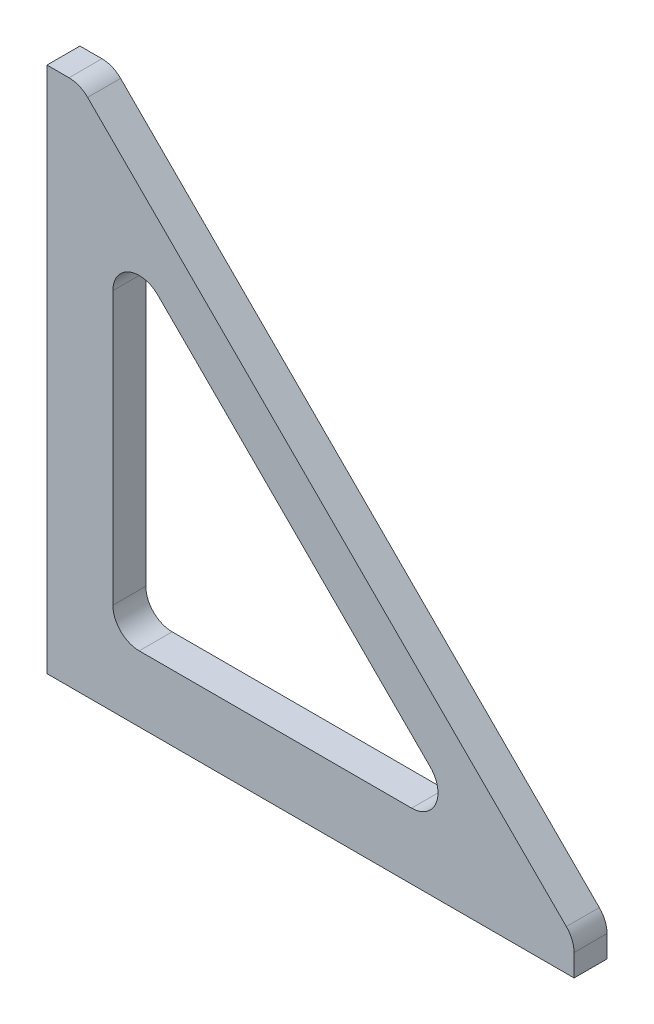
ISO-10303-21;
HEADER;
FILE_DESCRIPTION(('STEP AP214'),'2;1');
FILE_NAME('part.step','',(''),(''),'','','');
FILE_SCHEMA(('AUTOMOTIVE_DESIGN { 1 0 10303 214 1 1 1 1 }'));
ENDSEC;
DATA;
#1=APPLICATION_CONTEXT('core data for automotive mechanical design processes');
#2=APPLICATION_PROTOCOL_DEFINITION('international standard','automotive_design',2000,#1);
#3=PRODUCT_CONTEXT('',#1,'mechanical');
#4=PRODUCT('Part','Part','',(#3));
#5=PRODUCT_RELATED_PRODUCT_CATEGORY('part','',(#4));
#6=PRODUCT_DEFINITION_FORMATION('','',#4);
#7=PRODUCT_DEFINITION_CONTEXT('part definition',#1,'design');
#8=PRODUCT_DEFINITION('design','',#6,#7);
#9=PRODUCT_DEFINITION_SHAPE('','',#8);
#10=(LENGTH_UNIT() NAMED_UNIT(*) SI_UNIT(.MILLI.,.METRE.));
#11=(NAMED_UNIT(*) PLANE_ANGLE_UNIT() SI_UNIT($,.RADIAN.));
#12=(NAMED_UNIT(*) SI_UNIT($,.STERADIAN.) SOLID_ANGLE_UNIT());
#13=UNCERTAINTY_MEASURE_WITH_UNIT(LENGTH_MEASURE(1.E-05),#10,'distance_accuracy_value','');
#14=(GEOMETRIC_REPRESENTATION_CONTEXT(3) GLOBAL_UNCERTAINTY_ASSIGNED_CONTEXT((#13)) GLOBAL_UNIT_ASSIGNED_CONTEXT((#10,
#11,#12)) REPRESENTATION_CONTEXT('',''));
#15=CARTESIAN_POINT('',(0.,0.,0.));
#16=DIRECTION('',(0.,0.,1.));
#17=DIRECTION('',(1.,0.,0.));
#18=AXIS2_PLACEMENT_3D('',#15,#16,#17);
#19=CARTESIAN_POINT('',(50.8,3.175,3.175));
#20=DIRECTION('',(1.,0.,0.));
#21=DIRECTION('',(0.,0.,-1.));
#22=AXIS2_PLACEMENT_3D('',#19,#20,#21);
#23=PLANE('',#22);
#24=DIRECTION('',(0.,-1.,0.));
#25=VECTOR('',#24,1.);
#26=CARTESIAN_POINT('',(50.8,3.175,0.));
#27=LINE('',#26,#25);
#28=CARTESIAN_POINT('',(50.8,2.12289755157234,0.));
#29=VERTEX_POINT('',#28);
#30=CARTESIAN_POINT('',(50.8,0.,0.));
#31=VERTEX_POINT('',#30);
#32=EDGE_CURVE('E305',#29,#31,#27,.T.);
#33=ORIENTED_EDGE('',*,*,#32,.F.);
#34=DIRECTION('',(0.,0.,-1.));
#35=VECTOR('',#34,1.);
#36=CARTESIAN_POINT('',(50.8,2.12289755157234,3.175));
#37=LINE('',#36,#35);
#38=CARTESIAN_POINT('',(50.8,2.12289755157234,3.175));
#39=VERTEX_POINT('',#38);
#40=EDGE_CURVE('E152',#29,#39,#37,.F.);
#41=ORIENTED_EDGE('',*,*,#40,.T.);
#42=DIRECTION('',(0.,-1.,0.));
#43=VECTOR('',#42,1.);
#44=CARTESIAN_POINT('',(50.8,3.175,3.175));
#45=LINE('',#44,#43);
#46=CARTESIAN_POINT('',(50.8,0.,3.175));
#47=VERTEX_POINT('',#46);
#48=EDGE_CURVE('E146',#39,#47,#45,.T.);
#49=ORIENTED_EDGE('',*,*,#48,.T.);
#50=DIRECTION('',(0.,0.,-1.));
#51=VECTOR('',#50,1.);
#52=CARTESIAN_POINT('',(50.8,0.,3.175));
#53=LINE('',#52,#51);
#54=EDGE_CURVE('E149',#47,#31,#53,.T.);
#55=ORIENTED_EDGE('',*,*,#54,.T.);
#56=EDGE_LOOP('',(#33,#41,#49,#55));
#57=FACE_BOUND('',#56,.T.);
#58=ADVANCED_FACE('F50',(#57),#23,.T.);
#59=CARTESIAN_POINT('',(3.175,50.8,3.175));
#60=DIRECTION('',(0.707106781186548,0.707106781186548,0.));
#61=DIRECTION('',(-0.707106781186548,0.707106781186548,0.));
#62=AXIS2_PLACEMENT_3D('',#59,#60,#61);
#63=PLANE('',#62);
#64=DIRECTION('',(0.707106781186547,-0.707106781186547,0.));
#65=VECTOR('',#64,1.);
#66=CARTESIAN_POINT('',(3.175,50.8,0.));
#67=LINE('',#66,#65);
#68=CARTESIAN_POINT('',(3.91894877578617,50.0560512242138,0.));
#69=VERTEX_POINT('',#68);
#70=CARTESIAN_POINT('',(50.0560512242138,3.91894877578618,0.));
#71=VERTEX_POINT('',#70);
#72=EDGE_CURVE('E158',#69,#71,#67,.T.);
#73=ORIENTED_EDGE('',*,*,#72,.F.);
#74=DIRECTION('',(0.,0.,-1.));
#75=VECTOR('',#74,1.);
#76=CARTESIAN_POINT('',(3.91894877578617,50.0560512242138,3.175));
#77=LINE('',#76,#75);
#78=CARTESIAN_POINT('',(3.91894877578617,50.0560512242138,3.175));
#79=VERTEX_POINT('',#78);
#80=EDGE_CURVE('E226',#69,#79,#77,.F.);
#81=ORIENTED_EDGE('',*,*,#80,.T.);
#82=DIRECTION('',(0.707106781186547,-0.707106781186547,0.));
#83=VECTOR('',#82,1.);
#84=CARTESIAN_POINT('',(3.175,50.8,3.175));
#85=LINE('',#84,#83);
#86=CARTESIAN_POINT('',(50.0560512242138,3.91894877578618,3.175));
#87=VERTEX_POINT('',#86);
#88=EDGE_CURVE('E167',#79,#87,#85,.T.);
#89=ORIENTED_EDGE('',*,*,#88,.T.);
#90=DIRECTION('',(0.,0.,-1.));
#91=VECTOR('',#90,1.);
#92=CARTESIAN_POINT('',(50.0560512242138,3.91894877578618,3.175));
#93=LINE('',#92,#91);
#94=EDGE_CURVE('E222',#87,#71,#93,.T.);
#95=ORIENTED_EDGE('',*,*,#94,.T.);
#96=EDGE_LOOP('',(#73,#81,#89,#95));
#97=FACE_BOUND('',#96,.T.);
#98=ADVANCED_FACE('F331',(#97),#63,.T.);
#99=CARTESIAN_POINT('',(0.,50.8,3.175));
#100=DIRECTION('',(0.,1.,0.));
#101=DIRECTION('',(0.,0.,1.));
#102=AXIS2_PLACEMENT_3D('',#99,#100,#101);
#103=PLANE('',#102);
#104=DIRECTION('',(1.,0.,0.));
#105=VECTOR('',#104,1.);
#106=CARTESIAN_POINT('',(0.,50.8,3.175));
#107=LINE('',#106,#105);
#108=CARTESIAN_POINT('',(0.,50.8,3.175));
#109=VERTEX_POINT('',#108);
#110=CARTESIAN_POINT('',(2.12289755157234,50.8,3.175));
#111=VERTEX_POINT('',#110);
#112=EDGE_CURVE('E180',#109,#111,#107,.T.);
#113=ORIENTED_EDGE('',*,*,#112,.T.);
#114=DIRECTION('',(0.,0.,-1.));
#115=VECTOR('',#114,1.);
#116=CARTESIAN_POINT('',(2.12289755157234,50.8,3.175));
#117=LINE('',#116,#115);
#118=CARTESIAN_POINT('',(2.12289755157234,50.8,0.));
#119=VERTEX_POINT('',#118);
#120=EDGE_CURVE('E210',#111,#119,#117,.T.);
#121=ORIENTED_EDGE('',*,*,#120,.T.);
#122=DIRECTION('',(1.,0.,0.));
#123=VECTOR('',#122,1.);
#124=CARTESIAN_POINT('',(0.,50.8,0.));
#125=LINE('',#124,#123);
#126=CARTESIAN_POINT('',(0.,50.8,0.));
#127=VERTEX_POINT('',#126);
#128=EDGE_CURVE('E198',#127,#119,#125,.T.);
#129=ORIENTED_EDGE('',*,*,#128,.F.);
#130=DIRECTION('',(0.,0.,-1.));
#131=VECTOR('',#130,1.);
#132=CARTESIAN_POINT('',(0.,50.8,3.175));
#133=LINE('',#132,#131);
#134=EDGE_CURVE('E206',#109,#127,#133,.T.);
#135=ORIENTED_EDGE('',*,*,#134,.F.);
#136=EDGE_LOOP('',(#113,#121,#129,#135));
#137=FACE_BOUND('',#136,.T.);
#138=ADVANCED_FACE('F322',(#137),#103,.T.);
#139=CARTESIAN_POINT('',(0.,0.,3.175));
#140=DIRECTION('',(-1.,0.,0.));
#141=DIRECTION('',(0.,0.,1.));
#142=AXIS2_PLACEMENT_3D('',#139,#140,#141);
#143=PLANE('',#142);
#144=DIRECTION('',(0.,1.,0.));
#145=VECTOR('',#144,1.);
#146=CARTESIAN_POINT('',(0.,0.,0.));
#147=LINE('',#146,#145);
#148=CARTESIAN_POINT('',(0.,0.,0.));
#149=VERTEX_POINT('',#148);
#150=EDGE_CURVE('E193',#149,#127,#147,.T.);
#151=ORIENTED_EDGE('',*,*,#150,.F.);
#152=DIRECTION('',(0.,0.,-1.));
#153=VECTOR('',#152,1.);
#154=CARTESIAN_POINT('',(0.,0.,3.175));
#155=LINE('',#154,#153);
#156=CARTESIAN_POINT('',(0.,0.,3.175));
#157=VERTEX_POINT('',#156);
#158=EDGE_CURVE('E166',#157,#149,#155,.T.);
#159=ORIENTED_EDGE('',*,*,#158,.F.);
#160=DIRECTION('',(0.,1.,0.));
#161=VECTOR('',#160,1.);
#162=CARTESIAN_POINT('',(0.,0.,3.175));
#163=LINE('',#162,#161);
#164=EDGE_CURVE('E174',#157,#109,#163,.T.);
#165=ORIENTED_EDGE('',*,*,#164,.T.);
#166=ORIENTED_EDGE('',*,*,#134,.T.);
#167=EDGE_LOOP('',(#151,#159,#165,#166));
#168=FACE_BOUND('',#167,.T.);
#169=ADVANCED_FACE('F355',(#168),#143,.T.);
#170=CARTESIAN_POINT('',(50.8,0.,3.175));
#171=DIRECTION('',(0.,-1.,0.));
#172=DIRECTION('',(0.,0.,-1.));
#173=AXIS2_PLACEMENT_3D('',#170,#171,#172);
#174=PLANE('',#173);
#175=DIRECTION('',(-1.,0.,0.));
#176=VECTOR('',#175,1.);
#177=CARTESIAN_POINT('',(50.8,0.,0.));
#178=LINE('',#177,#176);
#179=EDGE_CURVE('E164',#31,#149,#178,.T.);
#180=ORIENTED_EDGE('',*,*,#179,.F.);
#181=ORIENTED_EDGE('',*,*,#54,.F.);
#182=DIRECTION('',(-1.,0.,0.));
#183=VECTOR('',#182,1.);
#184=CARTESIAN_POINT('',(50.8,0.,3.175));
#185=LINE('',#184,#183);
#186=EDGE_CURVE('E157',#47,#157,#185,.T.);
#187=ORIENTED_EDGE('',*,*,#186,.T.);
#188=ORIENTED_EDGE('',*,*,#158,.T.);
#189=EDGE_LOOP('',(#180,#181,#187,#188));
#190=FACE_BOUND('',#189,.T.);
#191=ADVANCED_FACE('F162',(#190),#174,.T.);
#192=CARTESIAN_POINT('',(0.,0.,3.175));
#193=DIRECTION('',(0.,0.,-1.));
#194=DIRECTION('',(-1.,0.,0.));
#195=AXIS2_PLACEMENT_3D('',#192,#193,#194);
#196=PLANE('',#195);
#197=DIRECTION('',(1.,0.,0.));
#198=VECTOR('',#197,1.);
#199=CARTESIAN_POINT('',(6.35,6.35,3.175));
#200=LINE('',#199,#198);
#201=CARTESIAN_POINT('',(8.89,6.35,3.175));
#202=VERTEX_POINT('',#201);
#203=CARTESIAN_POINT('',(35.1428975515723,6.35,3.175));
#204=VERTEX_POINT('',#203);
#205=EDGE_CURVE('E292',#202,#204,#200,.T.);
#206=ORIENTED_EDGE('',*,*,#205,.F.);
#207=CARTESIAN_POINT('',(8.89,8.89,3.175));
#208=DIRECTION('',(0.,0.,-1.));
#209=DIRECTION('',(-1.,0.,0.));
#210=AXIS2_PLACEMENT_3D('',#207,#208,#209);
#211=CIRCLE('',#210,2.54);
#212=CARTESIAN_POINT('',(6.35,8.89,3.175));
#213=VERTEX_POINT('',#212);
#214=EDGE_CURVE('E263',#202,#213,#211,.T.);
#215=ORIENTED_EDGE('',*,*,#214,.T.);
#216=DIRECTION('',(0.,-1.,0.));
#217=VECTOR('',#216,1.);
#218=CARTESIAN_POINT('',(6.35,41.275,3.175));
#219=LINE('',#218,#217);
#220=CARTESIAN_POINT('',(6.35,35.1428975515723,3.175));
#221=VERTEX_POINT('',#220);
#222=EDGE_CURVE('E277',#221,#213,#219,.T.);
#223=ORIENTED_EDGE('',*,*,#222,.F.);
#224=CARTESIAN_POINT('',(8.89,35.1428975515723,3.175));
#225=DIRECTION('',(0.,0.,-1.));
#226=DIRECTION('',(-1.,0.,0.));
#227=AXIS2_PLACEMENT_3D('',#224,#225,#226);
#228=CIRCLE('',#227,2.54);
#229=CARTESIAN_POINT('',(10.6860512242138,36.9389487757862,3.175));
#230=VERTEX_POINT('',#229);
#231=EDGE_CURVE('E59',#221,#230,#228,.T.);
#232=ORIENTED_EDGE('',*,*,#231,.T.);
#233=DIRECTION('',(-0.707106781186548,0.707106781186548,0.));
#234=VECTOR('',#233,1.);
#235=CARTESIAN_POINT('',(41.275,6.35,3.175));
#236=LINE('',#235,#234);
#237=CARTESIAN_POINT('',(36.9389487757862,10.6860512242138,3.175));
#238=VERTEX_POINT('',#237);
#239=EDGE_CURVE('E276',#238,#230,#236,.T.);
#240=ORIENTED_EDGE('',*,*,#239,.F.);
#241=CARTESIAN_POINT('',(35.1428975515723,8.89,3.175));
#242=DIRECTION('',(0.,0.,-1.));
#243=DIRECTION('',(-1.,0.,0.));
#244=AXIS2_PLACEMENT_3D('',#241,#242,#243);
#245=CIRCLE('',#244,2.54);
#246=EDGE_CURVE('E257',#238,#204,#245,.T.);
#247=ORIENTED_EDGE('',*,*,#246,.T.);
#248=EDGE_LOOP('',(#206,#215,#223,#232,#240,#247));
#249=FACE_BOUND('',#248,.T.);
#250=ORIENTED_EDGE('',*,*,#88,.F.);
#251=CARTESIAN_POINT('',(2.12289755157234,48.26,3.175));
#252=DIRECTION('',(0.,0.,-1.));
#253=DIRECTION('',(-1.,0.,0.));
#254=AXIS2_PLACEMENT_3D('',#251,#252,#253);
#255=CIRCLE('',#254,2.54);
#256=EDGE_CURVE('E232',#79,#111,#255,.F.);
#257=ORIENTED_EDGE('',*,*,#256,.T.);
#258=ORIENTED_EDGE('',*,*,#112,.F.);
#259=ORIENTED_EDGE('',*,*,#164,.F.);
#260=ORIENTED_EDGE('',*,*,#186,.F.);
#261=ORIENTED_EDGE('',*,*,#48,.F.);
#262=CARTESIAN_POINT('',(48.26,2.12289755157234,3.175));
#263=DIRECTION('',(0.,0.,-1.));
#264=DIRECTION('',(-1.,0.,0.));
#265=AXIS2_PLACEMENT_3D('',#262,#263,#264);
#266=CIRCLE('',#265,2.54);
#267=EDGE_CURVE('E229',#39,#87,#266,.F.);
#268=ORIENTED_EDGE('',*,*,#267,.T.);
#269=EDGE_LOOP('',(#250,#257,#258,#259,#260,#261,#268));
#270=FACE_BOUND('',#269,.T.);
#271=ADVANCED_FACE('F171',(#249,#270),#196,.F.);
#272=CARTESIAN_POINT('',(0.,0.,0.));
#273=DIRECTION('',(0.,0.,-1.));
#274=DIRECTION('',(-1.,0.,0.));
#275=AXIS2_PLACEMENT_3D('',#272,#273,#274);
#276=PLANE('',#275);
#277=DIRECTION('',(-0.707106781186548,0.707106781186548,0.));
#278=VECTOR('',#277,1.);
#279=CARTESIAN_POINT('',(41.275,6.35,0.));
#280=LINE('',#279,#278);
#281=CARTESIAN_POINT('',(36.9389487757862,10.6860512242138,0.));
#282=VERTEX_POINT('',#281);
#283=CARTESIAN_POINT('',(10.6860512242138,36.9389487757862,0.));
#284=VERTEX_POINT('',#283);
#285=EDGE_CURVE('E299',#282,#284,#280,.T.);
#286=ORIENTED_EDGE('',*,*,#285,.T.);
#287=CARTESIAN_POINT('',(8.89,35.1428975515723,0.));
#288=DIRECTION('',(0.,0.,-1.));
#289=DIRECTION('',(-1.,0.,0.));
#290=AXIS2_PLACEMENT_3D('',#287,#288,#289);
#291=CIRCLE('',#290,2.54);
#292=CARTESIAN_POINT('',(6.35,35.1428975515723,0.));
#293=VERTEX_POINT('',#292);
#294=EDGE_CURVE('E12',#284,#293,#291,.F.);
#295=ORIENTED_EDGE('',*,*,#294,.T.);
#296=DIRECTION('',(0.,-1.,0.));
#297=VECTOR('',#296,1.);
#298=CARTESIAN_POINT('',(6.35,41.275,0.));
#299=LINE('',#298,#297);
#300=CARTESIAN_POINT('',(6.35,8.89,0.));
#301=VERTEX_POINT('',#300);
#302=EDGE_CURVE('E288',#293,#301,#299,.T.);
#303=ORIENTED_EDGE('',*,*,#302,.T.);
#304=CARTESIAN_POINT('',(8.89,8.89,0.));
#305=DIRECTION('',(0.,0.,-1.));
#306=DIRECTION('',(-1.,0.,0.));
#307=AXIS2_PLACEMENT_3D('',#304,#305,#306);
#308=CIRCLE('',#307,2.54);
#309=CARTESIAN_POINT('',(8.89,6.35,0.));
#310=VERTEX_POINT('',#309);
#311=EDGE_CURVE('E266',#301,#310,#308,.F.);
#312=ORIENTED_EDGE('',*,*,#311,.T.);
#313=DIRECTION('',(1.,0.,0.));
#314=VECTOR('',#313,1.);
#315=CARTESIAN_POINT('',(6.35,6.35,0.));
#316=LINE('',#315,#314);
#317=CARTESIAN_POINT('',(35.1428975515723,6.35,0.));
#318=VERTEX_POINT('',#317);
#319=EDGE_CURVE('E291',#310,#318,#316,.T.);
#320=ORIENTED_EDGE('',*,*,#319,.T.);
#321=CARTESIAN_POINT('',(35.1428975515723,8.89,0.));
#322=DIRECTION('',(0.,0.,-1.));
#323=DIRECTION('',(-1.,0.,0.));
#324=AXIS2_PLACEMENT_3D('',#321,#322,#323);
#325=CIRCLE('',#324,2.54);
#326=EDGE_CURVE('E260',#318,#282,#325,.F.);
#327=ORIENTED_EDGE('',*,*,#326,.T.);
#328=EDGE_LOOP('',(#286,#295,#303,#312,#320,#327));
#329=FACE_BOUND('',#328,.T.);
#330=ORIENTED_EDGE('',*,*,#128,.T.);
#331=CARTESIAN_POINT('',(2.12289755157234,48.26,0.));
#332=DIRECTION('',(0.,0.,-1.));
#333=DIRECTION('',(-1.,0.,0.));
#334=AXIS2_PLACEMENT_3D('',#331,#332,#333);
#335=CIRCLE('',#334,2.54);
#336=EDGE_CURVE('E219',#119,#69,#335,.T.);
#337=ORIENTED_EDGE('',*,*,#336,.T.);
#338=ORIENTED_EDGE('',*,*,#72,.T.);
#339=CARTESIAN_POINT('',(48.26,2.12289755157234,0.));
#340=DIRECTION('',(0.,0.,-1.));
#341=DIRECTION('',(-1.,0.,0.));
#342=AXIS2_PLACEMENT_3D('',#339,#340,#341);
#343=CIRCLE('',#342,2.54);
#344=EDGE_CURVE('E216',#71,#29,#343,.T.);
#345=ORIENTED_EDGE('',*,*,#344,.T.);
#346=ORIENTED_EDGE('',*,*,#32,.T.);
#347=ORIENTED_EDGE('',*,*,#179,.T.);
#348=ORIENTED_EDGE('',*,*,#150,.T.);
#349=EDGE_LOOP('',(#330,#337,#338,#345,#346,#347,#348));
#350=FACE_BOUND('',#349,.T.);
#351=ADVANCED_FACE('F329',(#329,#350),#276,.T.);
#352=CARTESIAN_POINT('',(6.35,41.275,-49.3914086658803));
#353=DIRECTION('',(-1.,0.,0.));
#354=DIRECTION('',(0.,-1.,0.));
#355=AXIS2_PLACEMENT_3D('',#352,#353,#354);
#356=PLANE('',#355);
#357=ORIENTED_EDGE('',*,*,#222,.T.);
#358=DIRECTION('',(0.,0.,1.));
#359=VECTOR('',#358,1.);
#360=CARTESIAN_POINT('',(6.35,8.89,0.));
#361=LINE('',#360,#359);
#362=EDGE_CURVE('E66',#213,#301,#361,.F.);
#363=ORIENTED_EDGE('',*,*,#362,.T.);
#364=ORIENTED_EDGE('',*,*,#302,.F.);
#365=DIRECTION('',(0.,0.,1.));
#366=VECTOR('',#365,1.);
#367=CARTESIAN_POINT('',(6.35,35.1428975515723,3.175));
#368=LINE('',#367,#366);
#369=EDGE_CURVE('E251',#293,#221,#368,.T.);
#370=ORIENTED_EDGE('',*,*,#369,.T.);
#371=EDGE_LOOP('',(#357,#363,#364,#370));
#372=FACE_BOUND('',#371,.T.);
#373=ADVANCED_FACE('F287',(#372),#356,.F.);
#374=CARTESIAN_POINT('',(6.35,6.35,-49.3914086658803));
#375=DIRECTION('',(0.,-1.,0.));
#376=DIRECTION('',(0.,0.,-1.));
#377=AXIS2_PLACEMENT_3D('',#374,#375,#376);
#378=PLANE('',#377);
#379=ORIENTED_EDGE('',*,*,#205,.T.);
#380=DIRECTION('',(0.,0.,1.));
#381=VECTOR('',#380,1.);
#382=CARTESIAN_POINT('',(35.1428975515723,6.35,0.));
#383=LINE('',#382,#381);
#384=EDGE_CURVE('E248',#204,#318,#383,.F.);
#385=ORIENTED_EDGE('',*,*,#384,.T.);
#386=ORIENTED_EDGE('',*,*,#319,.F.);
#387=DIRECTION('',(0.,0.,1.));
#388=VECTOR('',#387,1.);
#389=CARTESIAN_POINT('',(8.89,6.35,3.175));
#390=LINE('',#389,#388);
#391=EDGE_CURVE('E244',#310,#202,#390,.T.);
#392=ORIENTED_EDGE('',*,*,#391,.T.);
#393=EDGE_LOOP('',(#379,#385,#386,#392));
#394=FACE_BOUND('',#393,.T.);
#395=ADVANCED_FACE('F367',(#394),#378,.F.);
#396=CARTESIAN_POINT('',(41.275,6.35,-49.3914086658803));
#397=DIRECTION('',(0.707106781186548,0.707106781186548,0.));
#398=DIRECTION('',(-0.707106781186548,0.707106781186548,0.));
#399=AXIS2_PLACEMENT_3D('',#396,#397,#398);
#400=PLANE('',#399);
#401=ORIENTED_EDGE('',*,*,#285,.F.);
#402=DIRECTION('',(0.,0.,1.));
#403=VECTOR('',#402,1.);
#404=CARTESIAN_POINT('',(36.9389487757862,10.6860512242138,3.175));
#405=LINE('',#404,#403);
#406=EDGE_CURVE('E240',#282,#238,#405,.T.);
#407=ORIENTED_EDGE('',*,*,#406,.T.);
#408=ORIENTED_EDGE('',*,*,#239,.T.);
#409=DIRECTION('',(0.,0.,1.));
#410=VECTOR('',#409,1.);
#411=CARTESIAN_POINT('',(10.6860512242138,36.9389487757862,0.));
#412=LINE('',#411,#410);
#413=EDGE_CURVE('E237',#230,#284,#412,.F.);
#414=ORIENTED_EDGE('',*,*,#413,.T.);
#415=EDGE_LOOP('',(#401,#407,#408,#414));
#416=FACE_BOUND('',#415,.T.);
#417=ADVANCED_FACE('F283',(#416),#400,.F.);
#418=CARTESIAN_POINT('',(2.12289755157234,48.26,3.175));
#419=DIRECTION('',(0.,0.,-1.));
#420=DIRECTION('',(-1.,0.,0.));
#421=AXIS2_PLACEMENT_3D('',#418,#419,#420);
#422=CYLINDRICAL_SURFACE('',#421,2.54);
#423=ORIENTED_EDGE('',*,*,#256,.F.);
#424=ORIENTED_EDGE('',*,*,#80,.F.);
#425=ORIENTED_EDGE('',*,*,#336,.F.);
#426=ORIENTED_EDGE('',*,*,#120,.F.);
#427=EDGE_LOOP('',(#423,#424,#425,#426));
#428=FACE_BOUND('',#427,.T.);
#429=ADVANCED_FACE('F326',(#428),#422,.T.);
#430=CARTESIAN_POINT('',(48.26,2.12289755157234,3.175));
#431=DIRECTION('',(0.,0.,-1.));
#432=DIRECTION('',(-1.,0.,0.));
#433=AXIS2_PLACEMENT_3D('',#430,#431,#432);
#434=CYLINDRICAL_SURFACE('',#433,2.54);
#435=ORIENTED_EDGE('',*,*,#267,.F.);
#436=ORIENTED_EDGE('',*,*,#40,.F.);
#437=ORIENTED_EDGE('',*,*,#344,.F.);
#438=ORIENTED_EDGE('',*,*,#94,.F.);
#439=EDGE_LOOP('',(#435,#436,#437,#438));
#440=FACE_BOUND('',#439,.T.);
#441=ADVANCED_FACE('F334',(#440),#434,.T.);
#442=CARTESIAN_POINT('',(35.1428975515723,8.89,-49.3914086658803));
#443=DIRECTION('',(0.,0.,-1.));
#444=DIRECTION('',(-1.,0.,0.));
#445=AXIS2_PLACEMENT_3D('',#442,#443,#444);
#446=CYLINDRICAL_SURFACE('',#445,2.54);
#447=ORIENTED_EDGE('',*,*,#326,.F.);
#448=ORIENTED_EDGE('',*,*,#384,.F.);
#449=ORIENTED_EDGE('',*,*,#246,.F.);
#450=ORIENTED_EDGE('',*,*,#406,.F.);
#451=EDGE_LOOP('',(#447,#448,#449,#450));
#452=FACE_BOUND('',#451,.T.);
#453=ADVANCED_FACE('F336',(#452),#446,.F.);
#454=CARTESIAN_POINT('',(8.89,8.89,-49.3914086658803));
#455=DIRECTION('',(0.,0.,-1.));
#456=DIRECTION('',(-1.,0.,0.));
#457=AXIS2_PLACEMENT_3D('',#454,#455,#456);
#458=CYLINDRICAL_SURFACE('',#457,2.54);
#459=ORIENTED_EDGE('',*,*,#311,.F.);
#460=ORIENTED_EDGE('',*,*,#362,.F.);
#461=ORIENTED_EDGE('',*,*,#214,.F.);
#462=ORIENTED_EDGE('',*,*,#391,.F.);
#463=EDGE_LOOP('',(#459,#460,#461,#462));
#464=FACE_BOUND('',#463,.T.);
#465=ADVANCED_FACE('F342',(#464),#458,.F.);
#466=CARTESIAN_POINT('',(8.89,35.1428975515723,-49.3914086658803));
#467=DIRECTION('',(0.,0.,-1.));
#468=DIRECTION('',(-1.,0.,0.));
#469=AXIS2_PLACEMENT_3D('',#466,#467,#468);
#470=CYLINDRICAL_SURFACE('',#469,2.54);
#471=ORIENTED_EDGE('',*,*,#294,.F.);
#472=ORIENTED_EDGE('',*,*,#413,.F.);
#473=ORIENTED_EDGE('',*,*,#231,.F.);
#474=ORIENTED_EDGE('',*,*,#369,.F.);
#475=EDGE_LOOP('',(#471,#472,#473,#474));
#476=FACE_BOUND('',#475,.T.);
#477=ADVANCED_FACE('F52',(#476),#470,.F.);
#478=CLOSED_SHELL('',(#58,#98,#138,#169,#191,#271,#351,#373,#395,#417,#429,#441,#453,#465,#477));
#479=MANIFOLD_SOLID_BREP('B2',#478);
#480=ADVANCED_BREP_SHAPE_REPRESENTATION('',(#18,#479),#14);
#481=SHAPE_DEFINITION_REPRESENTATION(#9,#480);
ENDSEC;
END-ISO-10303-21;
